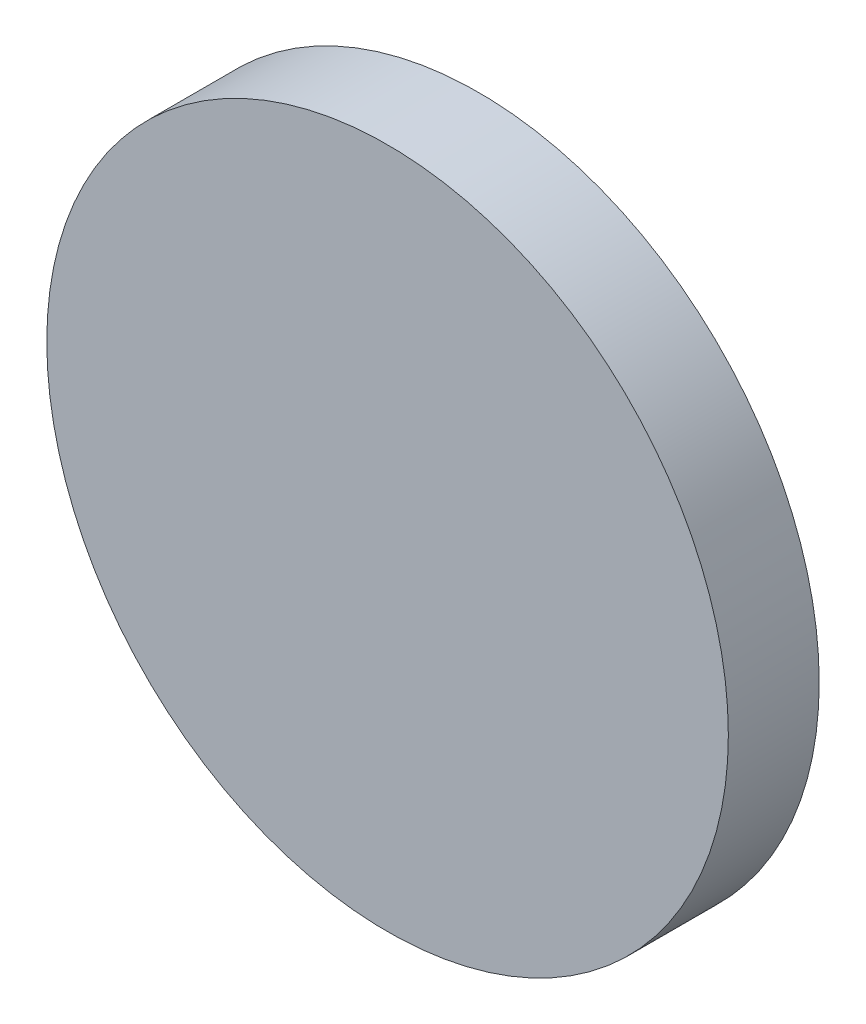
ISO-10303-21;
HEADER;
FILE_DESCRIPTION(('STEP AP214'),'2;1');
FILE_NAME('part.step','',(''),(''),'','','');
FILE_SCHEMA(('AUTOMOTIVE_DESIGN { 1 0 10303 214 1 1 1 1 }'));
ENDSEC;
DATA;
#1=APPLICATION_CONTEXT('core data for automotive mechanical design processes');
#2=APPLICATION_PROTOCOL_DEFINITION('international standard','automotive_design',2000,#1);
#3=PRODUCT_CONTEXT('',#1,'mechanical');
#4=PRODUCT('Part','Part','',(#3));
#5=PRODUCT_RELATED_PRODUCT_CATEGORY('part','',(#4));
#6=PRODUCT_DEFINITION_FORMATION('','',#4);
#7=PRODUCT_DEFINITION_CONTEXT('part definition',#1,'design');
#8=PRODUCT_DEFINITION('design','',#6,#7);
#9=PRODUCT_DEFINITION_SHAPE('','',#8);
#10=(LENGTH_UNIT() NAMED_UNIT(*) SI_UNIT(.MILLI.,.METRE.));
#11=(NAMED_UNIT(*) PLANE_ANGLE_UNIT() SI_UNIT($,.RADIAN.));
#12=(NAMED_UNIT(*) SI_UNIT($,.STERADIAN.) SOLID_ANGLE_UNIT());
#13=UNCERTAINTY_MEASURE_WITH_UNIT(LENGTH_MEASURE(1.E-05),#10,'distance_accuracy_value','');
#14=(GEOMETRIC_REPRESENTATION_CONTEXT(3) GLOBAL_UNCERTAINTY_ASSIGNED_CONTEXT((#13)) GLOBAL_UNIT_ASSIGNED_CONTEXT((#10,
#11,#12)) REPRESENTATION_CONTEXT('',''));
#15=CARTESIAN_POINT('',(0.,0.,0.));
#16=DIRECTION('',(0.,0.,1.));
#17=DIRECTION('',(1.,0.,0.));
#18=AXIS2_PLACEMENT_3D('',#15,#16,#17);
#19=CARTESIAN_POINT('',(0.,0.,16.));
#20=DIRECTION('',(0.,0.,-1.));
#21=DIRECTION('',(-1.,0.,0.));
#22=AXIS2_PLACEMENT_3D('',#19,#20,#21);
#23=CYLINDRICAL_SURFACE('',#22,60.);
#24=CARTESIAN_POINT('',(0.,0.,16.));
#25=DIRECTION('',(0.,0.,1.));
#26=DIRECTION('',(1.,0.,0.));
#27=AXIS2_PLACEMENT_3D('',#24,#25,#26);
#28=CIRCLE('',#27,60.);
#29=CARTESIAN_POINT('',(60.,0.,16.));
#30=VERTEX_POINT('',#29);
#31=EDGE_CURVE('E10',#30,#30,#28,.T.);
#32=ORIENTED_EDGE('',*,*,#31,.F.);
#33=EDGE_LOOP('',(#32));
#34=FACE_BOUND('',#33,.T.);
#35=CARTESIAN_POINT('',(0.,0.,0.));
#36=DIRECTION('',(0.,0.,1.));
#37=DIRECTION('',(1.,0.,0.));
#38=AXIS2_PLACEMENT_3D('',#35,#36,#37);
#39=CIRCLE('',#38,60.);
#40=CARTESIAN_POINT('',(60.,0.,0.));
#41=VERTEX_POINT('',#40);
#42=EDGE_CURVE('E38',#41,#41,#39,.T.);
#43=ORIENTED_EDGE('',*,*,#42,.T.);
#44=EDGE_LOOP('',(#43));
#45=FACE_BOUND('',#44,.T.);
#46=ADVANCED_FACE('F35',(#34,#45),#23,.T.);
#47=CARTESIAN_POINT('',(0.,0.,16.));
#48=DIRECTION('',(0.,0.,1.));
#49=DIRECTION('',(1.,0.,0.));
#50=AXIS2_PLACEMENT_3D('',#47,#48,#49);
#51=PLANE('',#50);
#52=ORIENTED_EDGE('',*,*,#31,.T.);
#53=EDGE_LOOP('',(#52));
#54=FACE_BOUND('',#53,.T.);
#55=ADVANCED_FACE('F50',(#54),#51,.T.);
#56=CARTESIAN_POINT('',(0.,0.,0.));
#57=DIRECTION('',(0.,0.,1.));
#58=DIRECTION('',(1.,0.,0.));
#59=AXIS2_PLACEMENT_3D('',#56,#57,#58);
#60=PLANE('',#59);
#61=ORIENTED_EDGE('',*,*,#42,.F.);
#62=EDGE_LOOP('',(#61));
#63=FACE_BOUND('',#62,.T.);
#64=ADVANCED_FACE('F48',(#63),#60,.F.);
#65=CLOSED_SHELL('',(#46,#55,#64));
#66=MANIFOLD_SOLID_BREP('B2',#65);
#67=ADVANCED_BREP_SHAPE_REPRESENTATION('',(#18,#66),#14);
#68=SHAPE_DEFINITION_REPRESENTATION(#9,#67);
ENDSEC;
END-ISO-10303-21;
